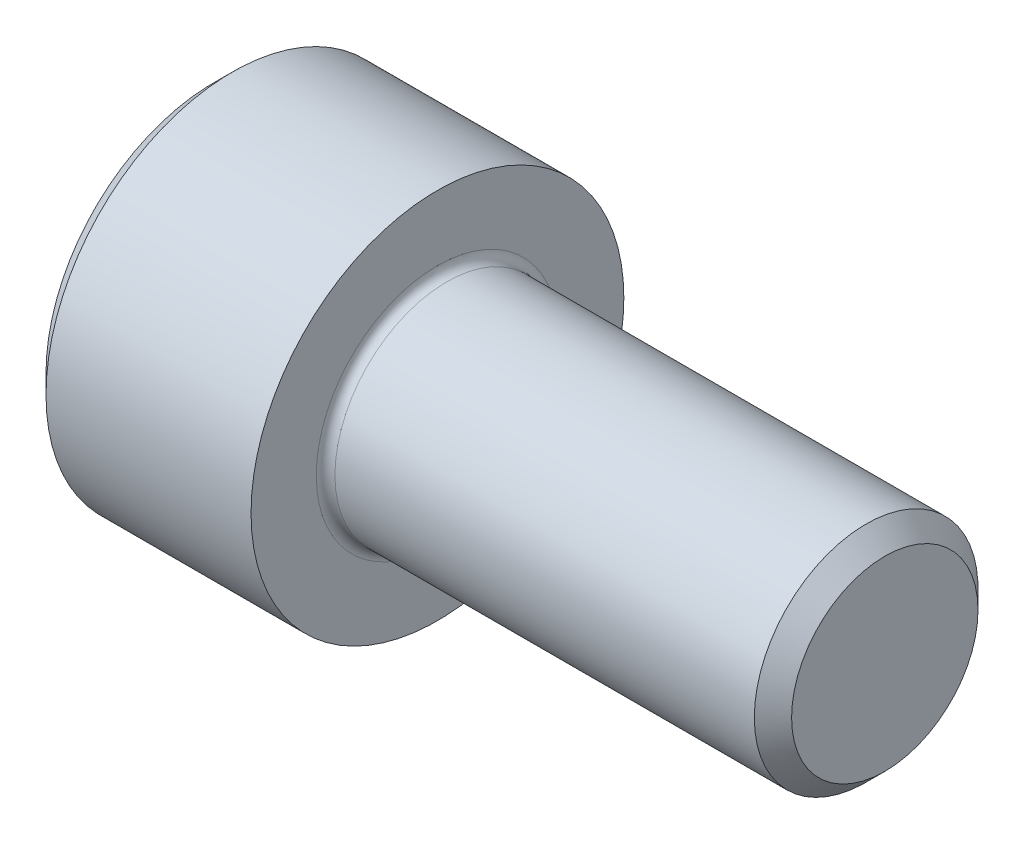
ISO-10303-21;
HEADER;
FILE_DESCRIPTION(('STEP AP214'),'2;1');
FILE_NAME('part.step','',(''),(''),'','','');
FILE_SCHEMA(('AUTOMOTIVE_DESIGN { 1 0 10303 214 1 1 1 1 }'));
ENDSEC;
DATA;
#1=APPLICATION_CONTEXT('core data for automotive mechanical design processes');
#2=APPLICATION_PROTOCOL_DEFINITION('international standard','automotive_design',2000,#1);
#3=PRODUCT_CONTEXT('',#1,'mechanical');
#4=PRODUCT('Part','Part','',(#3));
#5=PRODUCT_RELATED_PRODUCT_CATEGORY('part','',(#4));
#6=PRODUCT_DEFINITION_FORMATION('','',#4);
#7=PRODUCT_DEFINITION_CONTEXT('part definition',#1,'design');
#8=PRODUCT_DEFINITION('design','',#6,#7);
#9=PRODUCT_DEFINITION_SHAPE('','',#8);
#10=(LENGTH_UNIT() NAMED_UNIT(*) SI_UNIT(.MILLI.,.METRE.));
#11=(NAMED_UNIT(*) PLANE_ANGLE_UNIT() SI_UNIT($,.RADIAN.));
#12=(NAMED_UNIT(*) SI_UNIT($,.STERADIAN.) SOLID_ANGLE_UNIT());
#13=UNCERTAINTY_MEASURE_WITH_UNIT(LENGTH_MEASURE(1.E-05),#10,'distance_accuracy_value','');
#14=(GEOMETRIC_REPRESENTATION_CONTEXT(3) GLOBAL_UNCERTAINTY_ASSIGNED_CONTEXT((#13)) GLOBAL_UNIT_ASSIGNED_CONTEXT((#10,
#11,#12)) REPRESENTATION_CONTEXT('',''));
#15=CARTESIAN_POINT('',(0.,0.,0.));
#16=DIRECTION('',(0.,0.,1.));
#17=DIRECTION('',(1.,0.,0.));
#18=AXIS2_PLACEMENT_3D('',#15,#16,#17);
#19=CARTESIAN_POINT('',(18.,3.,0.));
#20=DIRECTION('',(-1.,0.,0.));
#21=DIRECTION('',(0.,0.,1.));
#22=AXIS2_PLACEMENT_3D('',#19,#20,#21);
#23=PLANE('',#22);
#24=CARTESIAN_POINT('',(18.,0.,0.));
#25=DIRECTION('',(-1.,0.,0.));
#26=DIRECTION('',(0.,0.,1.));
#27=AXIS2_PLACEMENT_3D('',#24,#25,#26);
#28=CIRCLE('',#27,2.49999999999999);
#29=CARTESIAN_POINT('',(18.,0.,2.49999999999999));
#30=VERTEX_POINT('',#29);
#31=EDGE_CURVE('E11',#30,#30,#28,.F.);
#32=ORIENTED_EDGE('',*,*,#31,.T.);
#33=EDGE_LOOP('',(#32));
#34=FACE_BOUND('',#33,.T.);
#35=ADVANCED_FACE('F40',(#34),#23,.F.);
#36=CARTESIAN_POINT('',(0.,0.,0.));
#37=DIRECTION('',(-1.,0.,0.));
#38=DIRECTION('',(0.,0.,1.));
#39=AXIS2_PLACEMENT_3D('',#36,#37,#38);
#40=CYLINDRICAL_SURFACE('',#39,3.);
#41=CARTESIAN_POINT('',(17.5,0.,0.));
#42=DIRECTION('',(-1.,0.,0.));
#43=DIRECTION('',(0.,0.,1.));
#44=AXIS2_PLACEMENT_3D('',#41,#42,#43);
#45=CIRCLE('',#44,3.);
#46=CARTESIAN_POINT('',(17.5,0.,3.));
#47=VERTEX_POINT('',#46);
#48=EDGE_CURVE('E49',#47,#47,#45,.T.);
#49=ORIENTED_EDGE('',*,*,#48,.T.);
#50=EDGE_LOOP('',(#49));
#51=FACE_BOUND('',#50,.T.);
#52=CARTESIAN_POINT('',(6.25,0.,0.));
#53=DIRECTION('',(-1.,0.,0.));
#54=DIRECTION('',(0.,0.,1.));
#55=AXIS2_PLACEMENT_3D('',#52,#53,#54);
#56=CIRCLE('',#55,3.);
#57=CARTESIAN_POINT('',(6.25,0.,3.));
#58=VERTEX_POINT('',#57);
#59=EDGE_CURVE('E132',#58,#58,#56,.T.);
#60=ORIENTED_EDGE('',*,*,#59,.F.);
#61=EDGE_LOOP('',(#60));
#62=FACE_BOUND('',#61,.T.);
#63=ADVANCED_FACE('F143',(#51,#62),#40,.T.);
#64=CARTESIAN_POINT('',(6.25,0.,0.));
#65=DIRECTION('',(-1.,0.,0.));
#66=DIRECTION('',(0.,0.,1.));
#67=AXIS2_PLACEMENT_3D('',#64,#65,#66);
#68=TOROIDAL_SURFACE('',#67,3.25,0.25);
#69=CARTESIAN_POINT('',(6.,0.,0.));
#70=DIRECTION('',(-1.,0.,0.));
#71=DIRECTION('',(0.,0.,1.));
#72=AXIS2_PLACEMENT_3D('',#69,#70,#71);
#73=CIRCLE('',#72,3.25);
#74=CARTESIAN_POINT('',(6.,0.,3.25));
#75=VERTEX_POINT('',#74);
#76=EDGE_CURVE('E129',#75,#75,#73,.T.);
#77=ORIENTED_EDGE('',*,*,#76,.F.);
#78=EDGE_LOOP('',(#77));
#79=FACE_BOUND('',#78,.T.);
#80=ORIENTED_EDGE('',*,*,#59,.T.);
#81=EDGE_LOOP('',(#80));
#82=FACE_BOUND('',#81,.T.);
#83=ADVANCED_FACE('F163',(#79,#82),#68,.F.);
#84=CARTESIAN_POINT('',(6.,5.,0.));
#85=DIRECTION('',(-1.,0.,0.));
#86=DIRECTION('',(0.,0.,1.));
#87=AXIS2_PLACEMENT_3D('',#84,#85,#86);
#88=PLANE('',#87);
#89=CARTESIAN_POINT('',(6.,0.,0.));
#90=DIRECTION('',(-1.,0.,0.));
#91=DIRECTION('',(0.,0.,1.));
#92=AXIS2_PLACEMENT_3D('',#89,#90,#91);
#93=CIRCLE('',#92,5.);
#94=CARTESIAN_POINT('',(6.,0.,5.));
#95=VERTEX_POINT('',#94);
#96=EDGE_CURVE('E118',#95,#95,#93,.T.);
#97=ORIENTED_EDGE('',*,*,#96,.F.);
#98=EDGE_LOOP('',(#97));
#99=FACE_BOUND('',#98,.T.);
#100=ORIENTED_EDGE('',*,*,#76,.T.);
#101=EDGE_LOOP('',(#100));
#102=FACE_BOUND('',#101,.T.);
#103=ADVANCED_FACE('F173',(#99,#102),#88,.F.);
#104=CARTESIAN_POINT('',(0.,0.,0.));
#105=DIRECTION('',(-1.,0.,0.));
#106=DIRECTION('',(0.,0.,1.));
#107=AXIS2_PLACEMENT_3D('',#104,#105,#106);
#108=CYLINDRICAL_SURFACE('',#107,5.);
#109=CARTESIAN_POINT('',(0.500000000000007,0.,0.));
#110=DIRECTION('',(1.,0.,0.));
#111=DIRECTION('',(0.,0.,-1.));
#112=AXIS2_PLACEMENT_3D('',#109,#110,#111);
#113=CIRCLE('',#112,5.);
#114=CARTESIAN_POINT('',(0.500000000000007,0.,-5.));
#115=VERTEX_POINT('',#114);
#116=EDGE_CURVE('E138',#115,#115,#113,.T.);
#117=ORIENTED_EDGE('',*,*,#116,.T.);
#118=EDGE_LOOP('',(#117));
#119=FACE_BOUND('',#118,.T.);
#120=ORIENTED_EDGE('',*,*,#96,.T.);
#121=EDGE_LOOP('',(#120));
#122=FACE_BOUND('',#121,.T.);
#123=ADVANCED_FACE('F177',(#119,#122),#108,.T.);
#124=CARTESIAN_POINT('',(0.,0.,0.));
#125=DIRECTION('',(1.,0.,0.));
#126=DIRECTION('',(0.,0.,-1.));
#127=AXIS2_PLACEMENT_3D('',#124,#125,#126);
#128=PLANE('',#127);
#129=DIRECTION('',(0.,0.5,0.866025403784439));
#130=VECTOR('',#129,1.);
#131=CARTESIAN_POINT('',(0.,-2.5,0.));
#132=LINE('',#131,#130);
#133=CARTESIAN_POINT('',(0.,-2.5,0.));
#134=VERTEX_POINT('',#133);
#135=CARTESIAN_POINT('',(0.,-1.25,2.1650635094611));
#136=VERTEX_POINT('',#135);
#137=EDGE_CURVE('E255',#134,#136,#132,.T.);
#138=ORIENTED_EDGE('',*,*,#137,.F.);
#139=DIRECTION('',(0.,-0.5,0.866025403784439));
#140=VECTOR('',#139,1.);
#141=CARTESIAN_POINT('',(0.,-1.25,-2.1650635094611));
#142=LINE('',#141,#140);
#143=CARTESIAN_POINT('',(0.,-1.25,-2.1650635094611));
#144=VERTEX_POINT('',#143);
#145=EDGE_CURVE('E56',#144,#134,#142,.T.);
#146=ORIENTED_EDGE('',*,*,#145,.F.);
#147=DIRECTION('',(0.,-1.,0.));
#148=VECTOR('',#147,1.);
#149=CARTESIAN_POINT('',(0.,1.25,-2.1650635094611));
#150=LINE('',#149,#148);
#151=CARTESIAN_POINT('',(0.,1.25,-2.1650635094611));
#152=VERTEX_POINT('',#151);
#153=EDGE_CURVE('E91',#152,#144,#150,.T.);
#154=ORIENTED_EDGE('',*,*,#153,.F.);
#155=DIRECTION('',(0.,-0.5,-0.866025403784438));
#156=VECTOR('',#155,1.);
#157=CARTESIAN_POINT('',(0.,2.5,0.));
#158=LINE('',#157,#156);
#159=CARTESIAN_POINT('',(0.,2.5,0.));
#160=VERTEX_POINT('',#159);
#161=EDGE_CURVE('E100',#160,#152,#158,.T.);
#162=ORIENTED_EDGE('',*,*,#161,.F.);
#163=DIRECTION('',(0.,0.5,-0.866025403784439));
#164=VECTOR('',#163,1.);
#165=CARTESIAN_POINT('',(0.,1.25,2.1650635094611));
#166=LINE('',#165,#164);
#167=CARTESIAN_POINT('',(0.,1.25,2.1650635094611));
#168=VERTEX_POINT('',#167);
#169=EDGE_CURVE('E106',#168,#160,#166,.T.);
#170=ORIENTED_EDGE('',*,*,#169,.F.);
#171=DIRECTION('',(0.,1.,0.));
#172=VECTOR('',#171,1.);
#173=CARTESIAN_POINT('',(0.,-1.25,2.1650635094611));
#174=LINE('',#173,#172);
#175=EDGE_CURVE('E257',#136,#168,#174,.T.);
#176=ORIENTED_EDGE('',*,*,#175,.F.);
#177=EDGE_LOOP('',(#138,#146,#154,#162,#170,#176));
#178=FACE_BOUND('',#177,.T.);
#179=CARTESIAN_POINT('',(0.,0.,0.));
#180=DIRECTION('',(1.,0.,0.));
#181=DIRECTION('',(0.,0.,-1.));
#182=AXIS2_PLACEMENT_3D('',#179,#180,#181);
#183=CIRCLE('',#182,4.5);
#184=CARTESIAN_POINT('',(0.,0.,-4.5));
#185=VERTEX_POINT('',#184);
#186=EDGE_CURVE('E135',#185,#185,#183,.F.);
#187=ORIENTED_EDGE('',*,*,#186,.T.);
#188=EDGE_LOOP('',(#187));
#189=FACE_BOUND('',#188,.T.);
#190=ADVANCED_FACE('F109',(#178,#189),#128,.F.);
#191=CARTESIAN_POINT('',(0.,0.,0.));
#192=DIRECTION('',(1.,0.,0.));
#193=DIRECTION('',(0.,0.,-1.));
#194=AXIS2_PLACEMENT_3D('',#191,#192,#193);
#195=CONICAL_SURFACE('',#194,4.5,0.785398163397445);
#196=ORIENTED_EDGE('',*,*,#116,.F.);
#197=EDGE_LOOP('',(#196));
#198=FACE_BOUND('',#197,.T.);
#199=ORIENTED_EDGE('',*,*,#186,.F.);
#200=EDGE_LOOP('',(#199));
#201=FACE_BOUND('',#200,.T.);
#202=ADVANCED_FACE('F148',(#198,#201),#195,.T.);
#203=CARTESIAN_POINT('',(17.5,0.,0.));
#204=DIRECTION('',(-1.,0.,0.));
#205=DIRECTION('',(0.,0.,1.));
#206=AXIS2_PLACEMENT_3D('',#203,#204,#205);
#207=CONICAL_SURFACE('',#206,3.,0.785398163397456);
#208=ORIENTED_EDGE('',*,*,#31,.F.);
#209=EDGE_LOOP('',(#208));
#210=FACE_BOUND('',#209,.T.);
#211=ORIENTED_EDGE('',*,*,#48,.F.);
#212=EDGE_LOOP('',(#211));
#213=FACE_BOUND('',#212,.T.);
#214=ADVANCED_FACE('F43',(#210,#213),#207,.T.);
#215=CARTESIAN_POINT('',(3.,-1.25,-2.1650635094611));
#216=DIRECTION('',(0.,-0.866025403784438,-0.5));
#217=DIRECTION('',(0.,0.5,-0.866025403784439));
#218=AXIS2_PLACEMENT_3D('',#215,#216,#217);
#219=PLANE('',#218);
#220=ORIENTED_EDGE('',*,*,#145,.T.);
#221=DIRECTION('',(-1.,0.,0.));
#222=VECTOR('',#221,1.);
#223=CARTESIAN_POINT('',(3.,-2.5,0.));
#224=LINE('',#223,#222);
#225=CARTESIAN_POINT('',(3.,-2.5,0.));
#226=VERTEX_POINT('',#225);
#227=EDGE_CURVE('E125',#226,#134,#224,.T.);
#228=ORIENTED_EDGE('',*,*,#227,.F.);
#229=DIRECTION('',(0.,-0.5,0.866025403784439));
#230=VECTOR('',#229,1.);
#231=CARTESIAN_POINT('',(3.,-1.25,-2.1650635094611));
#232=LINE('',#231,#230);
#233=CARTESIAN_POINT('',(3.,-1.25,-2.1650635094611));
#234=VERTEX_POINT('',#233);
#235=EDGE_CURVE('E111',#234,#226,#232,.T.);
#236=ORIENTED_EDGE('',*,*,#235,.F.);
#237=DIRECTION('',(-1.,0.,0.));
#238=VECTOR('',#237,1.);
#239=CARTESIAN_POINT('',(3.,-1.25,-2.1650635094611));
#240=LINE('',#239,#238);
#241=EDGE_CURVE('E96',#234,#144,#240,.T.);
#242=ORIENTED_EDGE('',*,*,#241,.T.);
#243=EDGE_LOOP('',(#220,#228,#236,#242));
#244=FACE_BOUND('',#243,.T.);
#245=ADVANCED_FACE('F147',(#244),#219,.F.);
#246=CARTESIAN_POINT('',(3.,1.25,-2.1650635094611));
#247=DIRECTION('',(0.,0.,-1.));
#248=DIRECTION('',(-1.,0.,0.));
#249=AXIS2_PLACEMENT_3D('',#246,#247,#248);
#250=PLANE('',#249);
#251=ORIENTED_EDGE('',*,*,#153,.T.);
#252=ORIENTED_EDGE('',*,*,#241,.F.);
#253=DIRECTION('',(0.,-1.,0.));
#254=VECTOR('',#253,1.);
#255=CARTESIAN_POINT('',(3.,1.25,-2.1650635094611));
#256=LINE('',#255,#254);
#257=CARTESIAN_POINT('',(3.,1.25,-2.1650635094611));
#258=VERTEX_POINT('',#257);
#259=EDGE_CURVE('E93',#258,#234,#256,.T.);
#260=ORIENTED_EDGE('',*,*,#259,.F.);
#261=DIRECTION('',(-1.,0.,0.));
#262=VECTOR('',#261,1.);
#263=CARTESIAN_POINT('',(3.,1.25,-2.1650635094611));
#264=LINE('',#263,#262);
#265=EDGE_CURVE('E86',#258,#152,#264,.T.);
#266=ORIENTED_EDGE('',*,*,#265,.T.);
#267=EDGE_LOOP('',(#251,#252,#260,#266));
#268=FACE_BOUND('',#267,.T.);
#269=ADVANCED_FACE('F88',(#268),#250,.F.);
#270=CARTESIAN_POINT('',(3.,2.5,0.));
#271=DIRECTION('',(0.,0.866025403784438,-0.5));
#272=DIRECTION('',(0.,0.5,0.866025403784439));
#273=AXIS2_PLACEMENT_3D('',#270,#271,#272);
#274=PLANE('',#273);
#275=ORIENTED_EDGE('',*,*,#161,.T.);
#276=ORIENTED_EDGE('',*,*,#265,.F.);
#277=DIRECTION('',(0.,-0.5,-0.866025403784438));
#278=VECTOR('',#277,1.);
#279=CARTESIAN_POINT('',(3.,2.5,0.));
#280=LINE('',#279,#278);
#281=CARTESIAN_POINT('',(3.,2.5,0.));
#282=VERTEX_POINT('',#281);
#283=EDGE_CURVE('E225',#282,#258,#280,.T.);
#284=ORIENTED_EDGE('',*,*,#283,.F.);
#285=DIRECTION('',(-1.,0.,0.));
#286=VECTOR('',#285,1.);
#287=CARTESIAN_POINT('',(3.,2.5,0.));
#288=LINE('',#287,#286);
#289=EDGE_CURVE('E97',#282,#160,#288,.T.);
#290=ORIENTED_EDGE('',*,*,#289,.T.);
#291=EDGE_LOOP('',(#275,#276,#284,#290));
#292=FACE_BOUND('',#291,.T.);
#293=ADVANCED_FACE('F101',(#292),#274,.F.);
#294=CARTESIAN_POINT('',(3.,1.25,2.1650635094611));
#295=DIRECTION('',(0.,0.866025403784438,0.5));
#296=DIRECTION('',(0.,-0.5,0.866025403784439));
#297=AXIS2_PLACEMENT_3D('',#294,#295,#296);
#298=PLANE('',#297);
#299=ORIENTED_EDGE('',*,*,#169,.T.);
#300=ORIENTED_EDGE('',*,*,#289,.F.);
#301=DIRECTION('',(0.,0.5,-0.866025403784439));
#302=VECTOR('',#301,1.);
#303=CARTESIAN_POINT('',(3.,1.25,2.1650635094611));
#304=LINE('',#303,#302);
#305=CARTESIAN_POINT('',(3.,1.25,2.1650635094611));
#306=VERTEX_POINT('',#305);
#307=EDGE_CURVE('E248',#306,#282,#304,.T.);
#308=ORIENTED_EDGE('',*,*,#307,.F.);
#309=DIRECTION('',(-1.,0.,0.));
#310=VECTOR('',#309,1.);
#311=CARTESIAN_POINT('',(3.,1.25,2.1650635094611));
#312=LINE('',#311,#310);
#313=EDGE_CURVE('E121',#306,#168,#312,.T.);
#314=ORIENTED_EDGE('',*,*,#313,.T.);
#315=EDGE_LOOP('',(#299,#300,#308,#314));
#316=FACE_BOUND('',#315,.T.);
#317=ADVANCED_FACE('F192',(#316),#298,.F.);
#318=CARTESIAN_POINT('',(3.,-1.25,2.1650635094611));
#319=DIRECTION('',(0.,0.,1.));
#320=DIRECTION('',(1.,0.,0.));
#321=AXIS2_PLACEMENT_3D('',#318,#319,#320);
#322=PLANE('',#321);
#323=ORIENTED_EDGE('',*,*,#175,.T.);
#324=ORIENTED_EDGE('',*,*,#313,.F.);
#325=DIRECTION('',(0.,1.,0.));
#326=VECTOR('',#325,1.);
#327=CARTESIAN_POINT('',(3.,-1.25,2.1650635094611));
#328=LINE('',#327,#326);
#329=CARTESIAN_POINT('',(3.,-1.25,2.1650635094611));
#330=VERTEX_POINT('',#329);
#331=EDGE_CURVE('E245',#330,#306,#328,.T.);
#332=ORIENTED_EDGE('',*,*,#331,.F.);
#333=DIRECTION('',(-1.,0.,0.));
#334=VECTOR('',#333,1.);
#335=CARTESIAN_POINT('',(3.,-1.25,2.1650635094611));
#336=LINE('',#335,#334);
#337=EDGE_CURVE('E123',#330,#136,#336,.T.);
#338=ORIENTED_EDGE('',*,*,#337,.T.);
#339=EDGE_LOOP('',(#323,#324,#332,#338));
#340=FACE_BOUND('',#339,.T.);
#341=ADVANCED_FACE('F188',(#340),#322,.F.);
#342=CARTESIAN_POINT('',(3.,-2.5,0.));
#343=DIRECTION('',(0.,-0.866025403784439,0.5));
#344=DIRECTION('',(0.,-0.5,-0.866025403784439));
#345=AXIS2_PLACEMENT_3D('',#342,#343,#344);
#346=PLANE('',#345);
#347=ORIENTED_EDGE('',*,*,#137,.T.);
#348=ORIENTED_EDGE('',*,*,#337,.F.);
#349=DIRECTION('',(0.,0.5,0.866025403784439));
#350=VECTOR('',#349,1.);
#351=CARTESIAN_POINT('',(3.,-2.5,0.));
#352=LINE('',#351,#350);
#353=EDGE_CURVE('E114',#226,#330,#352,.T.);
#354=ORIENTED_EDGE('',*,*,#353,.F.);
#355=ORIENTED_EDGE('',*,*,#227,.T.);
#356=EDGE_LOOP('',(#347,#348,#354,#355));
#357=FACE_BOUND('',#356,.T.);
#358=ADVANCED_FACE('F184',(#357),#346,.F.);
#359=CARTESIAN_POINT('',(3.,2.5,0.));
#360=DIRECTION('',(1.,0.,0.));
#361=DIRECTION('',(0.,1.,0.));
#362=AXIS2_PLACEMENT_3D('',#359,#360,#361);
#363=PLANE('',#362);
#364=ORIENTED_EDGE('',*,*,#235,.T.);
#365=CARTESIAN_POINT('',(3.,0.,0.));
#366=DIRECTION('',(-1.,0.,0.));
#367=DIRECTION('',(0.,-1.,0.));
#368=AXIS2_PLACEMENT_3D('',#365,#366,#367);
#369=CIRCLE('',#368,2.5);
#370=EDGE_CURVE('E228',#234,#226,#369,.T.);
#371=ORIENTED_EDGE('',*,*,#370,.F.);
#372=EDGE_LOOP('',(#364,#371));
#373=FACE_BOUND('',#372,.T.);
#374=ADVANCED_FACE('F187',(#373),#363,.T.);
#375=ORIENTED_EDGE('',*,*,#353,.T.);
#376=EDGE_CURVE('E234',#226,#330,#369,.T.);
#377=ORIENTED_EDGE('',*,*,#376,.F.);
#378=EDGE_LOOP('',(#375,#377));
#379=FACE_BOUND('',#378,.T.);
#380=ADVANCED_FACE('F206',(#379),#363,.T.);
#381=ORIENTED_EDGE('',*,*,#331,.T.);
#382=EDGE_CURVE('E267',#330,#306,#369,.T.);
#383=ORIENTED_EDGE('',*,*,#382,.F.);
#384=EDGE_LOOP('',(#381,#383));
#385=FACE_BOUND('',#384,.T.);
#386=ADVANCED_FACE('F211',(#385),#363,.T.);
#387=ORIENTED_EDGE('',*,*,#307,.T.);
#388=EDGE_CURVE('E270',#306,#282,#369,.T.);
#389=ORIENTED_EDGE('',*,*,#388,.F.);
#390=EDGE_LOOP('',(#387,#389));
#391=FACE_BOUND('',#390,.T.);
#392=ADVANCED_FACE('F219',(#391),#363,.T.);
#393=ORIENTED_EDGE('',*,*,#283,.T.);
#394=EDGE_CURVE('E65',#282,#258,#369,.T.);
#395=ORIENTED_EDGE('',*,*,#394,.F.);
#396=EDGE_LOOP('',(#393,#395));
#397=FACE_BOUND('',#396,.T.);
#398=ADVANCED_FACE('F214',(#397),#363,.T.);
#399=ORIENTED_EDGE('',*,*,#259,.T.);
#400=EDGE_CURVE('E222',#258,#234,#369,.T.);
#401=ORIENTED_EDGE('',*,*,#400,.F.);
#402=EDGE_LOOP('',(#399,#401));
#403=FACE_BOUND('',#402,.T.);
#404=ADVANCED_FACE('F204',(#403),#363,.T.);
#405=CARTESIAN_POINT('',(4.5,0.,0.));
#406=DIRECTION('',(-1.,0.,0.));
#407=DIRECTION('',(0.,-1.,0.));
#408=AXIS2_PLACEMENT_3D('',#405,#406,#407);
#409=CONICAL_SURFACE('',#408,0.,1.03037682652431);
#410=ORIENTED_EDGE('',*,*,#376,.T.);
#411=ORIENTED_EDGE('',*,*,#382,.T.);
#412=ORIENTED_EDGE('',*,*,#388,.T.);
#413=ORIENTED_EDGE('',*,*,#394,.T.);
#414=ORIENTED_EDGE('',*,*,#400,.T.);
#415=ORIENTED_EDGE('',*,*,#370,.T.);
#416=EDGE_LOOP('',(#410,#411,#412,#413,#414,#415));
#417=FACE_BOUND('',#416,.T.);
#418=CARTESIAN_POINT('',(4.5,0.,0.));
#419=VERTEX_POINT('',#418);
#420=VERTEX_LOOP('',#419);
#421=FACE_BOUND('',#420,.T.);
#422=ADVANCED_FACE('F201',(#417,#421),#409,.F.);
#423=CLOSED_SHELL('',(#35,#63,#83,#103,#123,#190,#202,#214,#245,#269,#293,#317,#341,#358,#374,
#380,#386,#392,#398,#404,#422));
#424=MANIFOLD_SOLID_BREP('B2',#423);
#425=ADVANCED_BREP_SHAPE_REPRESENTATION('',(#18,#424),#14);
#426=SHAPE_DEFINITION_REPRESENTATION(#9,#425);
ENDSEC;
END-ISO-10303-21;
